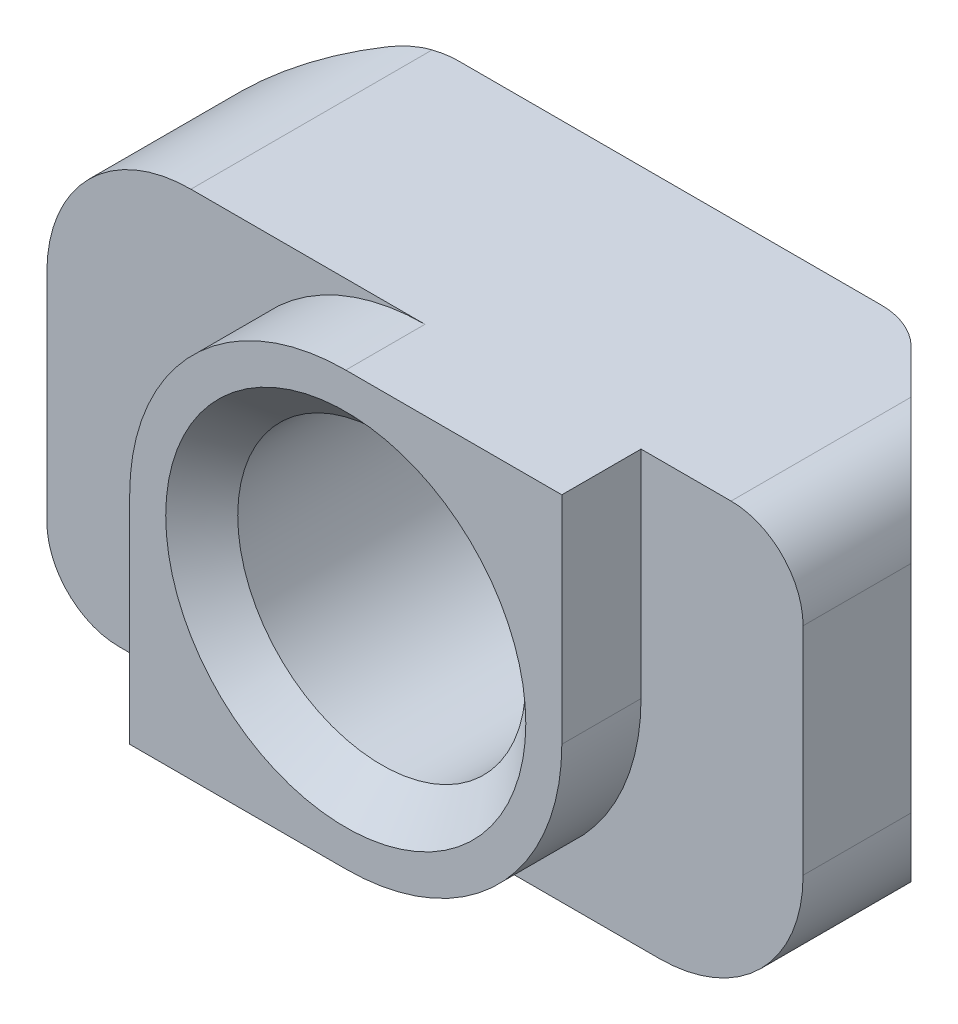
ISO-10303-21;
HEADER;
FILE_DESCRIPTION(('STEP AP214'),'2;1');
FILE_NAME('part.step','',(''),(''),'','','');
FILE_SCHEMA(('AUTOMOTIVE_DESIGN { 1 0 10303 214 1 1 1 1 }'));
ENDSEC;
DATA;
#1=APPLICATION_CONTEXT('core data for automotive mechanical design processes');
#2=APPLICATION_PROTOCOL_DEFINITION('international standard','automotive_design',2000,#1);
#3=PRODUCT_CONTEXT('',#1,'mechanical');
#4=PRODUCT('Part','Part','',(#3));
#5=PRODUCT_RELATED_PRODUCT_CATEGORY('part','',(#4));
#6=PRODUCT_DEFINITION_FORMATION('','',#4);
#7=PRODUCT_DEFINITION_CONTEXT('part definition',#1,'design');
#8=PRODUCT_DEFINITION('design','',#6,#7);
#9=PRODUCT_DEFINITION_SHAPE('','',#8);
#10=(LENGTH_UNIT() NAMED_UNIT(*) SI_UNIT(.MILLI.,.METRE.));
#11=(NAMED_UNIT(*) PLANE_ANGLE_UNIT() SI_UNIT($,.RADIAN.));
#12=(NAMED_UNIT(*) SI_UNIT($,.STERADIAN.) SOLID_ANGLE_UNIT());
#13=UNCERTAINTY_MEASURE_WITH_UNIT(LENGTH_MEASURE(1.E-05),#10,'distance_accuracy_value','');
#14=(GEOMETRIC_REPRESENTATION_CONTEXT(3) GLOBAL_UNCERTAINTY_ASSIGNED_CONTEXT((#13)) GLOBAL_UNIT_ASSIGNED_CONTEXT((#10,
#11,#12)) REPRESENTATION_CONTEXT('',''));
#15=CARTESIAN_POINT('',(0.,0.,0.));
#16=DIRECTION('',(0.,0.,1.));
#17=DIRECTION('',(1.,0.,0.));
#18=AXIS2_PLACEMENT_3D('',#15,#16,#17);
#19=CARTESIAN_POINT('',(-5.24999999992069,3.,4.5));
#20=DIRECTION('',(-1.,0.,0.));
#21=DIRECTION('',(0.,0.,1.));
#22=AXIS2_PLACEMENT_3D('',#19,#20,#21);
#23=PLANE('',#22);
#24=DIRECTION('',(0.,1.,0.));
#25=VECTOR('',#24,1.);
#26=CARTESIAN_POINT('',(-5.24999999992069,3.,1.9));
#27=LINE('',#26,#25);
#28=CARTESIAN_POINT('',(-5.24999999992069,-2.,1.9));
#29=VERTEX_POINT('',#28);
#30=CARTESIAN_POINT('',(-5.24999999992069,1.,1.9));
#31=VERTEX_POINT('',#30);
#32=EDGE_CURVE('E190',#29,#31,#27,.T.);
#33=ORIENTED_EDGE('',*,*,#32,.F.);
#34=DIRECTION('',(0.,0.,1.));
#35=VECTOR('',#34,1.);
#36=CARTESIAN_POINT('',(-5.24999999992069,-2.,4.5));
#37=LINE('',#36,#35);
#38=CARTESIAN_POINT('',(-5.24999999992069,-2.,3.4));
#39=VERTEX_POINT('',#38);
#40=EDGE_CURVE('E158',#29,#39,#37,.T.);
#41=ORIENTED_EDGE('',*,*,#40,.T.);
#42=DIRECTION('',(0.,1.,0.));
#43=VECTOR('',#42,1.);
#44=CARTESIAN_POINT('',(-5.24999999992069,-3.,3.4));
#45=LINE('',#44,#43);
#46=CARTESIAN_POINT('',(-5.24999999992069,1.,3.4));
#47=VERTEX_POINT('',#46);
#48=EDGE_CURVE('E462',#39,#47,#45,.T.);
#49=ORIENTED_EDGE('',*,*,#48,.T.);
#50=DIRECTION('',(0.,0.,-1.));
#51=VECTOR('',#50,1.);
#52=CARTESIAN_POINT('',(-5.24999999992069,1.,4.5));
#53=LINE('',#52,#51);
#54=EDGE_CURVE('E172',#31,#47,#53,.F.);
#55=ORIENTED_EDGE('',*,*,#54,.F.);
#56=EDGE_LOOP('',(#33,#41,#49,#55));
#57=FACE_BOUND('',#56,.T.);
#58=ADVANCED_FACE('F20',(#57),#23,.T.);
#59=CARTESIAN_POINT('',(0.,0.,0.));
#60=DIRECTION('',(0.,0.,-1.));
#61=DIRECTION('',(-1.,0.,0.));
#62=AXIS2_PLACEMENT_3D('',#59,#60,#61);
#63=CYLINDRICAL_SURFACE('',#62,2.);
#64=CARTESIAN_POINT('',(0.,0.,4.00000000007594));
#65=DIRECTION('',(0.,0.,1.));
#66=DIRECTION('',(1.,0.,0.));
#67=AXIS2_PLACEMENT_3D('',#64,#65,#66);
#68=CIRCLE('',#67,2.00000000000955);
#69=CARTESIAN_POINT('',(2.00000000000955,0.,4.00000000007594));
#70=VERTEX_POINT('',#69);
#71=EDGE_CURVE('E176',#70,#70,#68,.T.);
#72=ORIENTED_EDGE('',*,*,#71,.T.);
#73=EDGE_LOOP('',(#72));
#74=FACE_BOUND('',#73,.T.);
#75=CARTESIAN_POINT('',(0.,0.,0.50000000004502));
#76=DIRECTION('',(0.,0.,-1.));
#77=DIRECTION('',(-1.,0.,0.));
#78=AXIS2_PLACEMENT_3D('',#75,#76,#77);
#79=CIRCLE('',#78,1.99999999995271);
#80=CARTESIAN_POINT('',(-1.99999999995271,0.,0.50000000004502));
#81=VERTEX_POINT('',#80);
#82=EDGE_CURVE('E291',#81,#81,#79,.T.);
#83=ORIENTED_EDGE('',*,*,#82,.T.);
#84=EDGE_LOOP('',(#83));
#85=FACE_BOUND('',#84,.T.);
#86=ADVANCED_FACE('F301',(#74,#85),#63,.F.);
#87=CARTESIAN_POINT('',(4.25000000007932,2.,1.9));
#88=DIRECTION('',(0.,0.,1.));
#89=DIRECTION('',(1.,0.,0.));
#90=AXIS2_PLACEMENT_3D('',#87,#88,#89);
#91=CYLINDRICAL_SURFACE('',#90,1.);
#92=CARTESIAN_POINT('',(4.25000000007932,2.,3.4));
#93=DIRECTION('',(0.,0.,1.));
#94=DIRECTION('',(1.,0.,0.));
#95=AXIS2_PLACEMENT_3D('',#92,#93,#94);
#96=CIRCLE('',#95,1.);
#97=CARTESIAN_POINT('',(4.25000000007932,3.,3.4));
#98=VERTEX_POINT('',#97);
#99=CARTESIAN_POINT('',(5.25000000007931,2.,3.4));
#100=VERTEX_POINT('',#99);
#101=EDGE_CURVE('E23',#98,#100,#96,.F.);
#102=ORIENTED_EDGE('',*,*,#101,.T.);
#103=DIRECTION('',(0.,0.,1.));
#104=VECTOR('',#103,1.);
#105=CARTESIAN_POINT('',(5.25000000007932,2.,1.9));
#106=LINE('',#105,#104);
#107=CARTESIAN_POINT('',(5.25000000007932,2.,1.9));
#108=VERTEX_POINT('',#107);
#109=EDGE_CURVE('E157',#100,#108,#106,.F.);
#110=ORIENTED_EDGE('',*,*,#109,.T.);
#111=CARTESIAN_POINT('',(4.25000000007932,2.,0.899999999999999));
#112=DIRECTION('',(0.707106781186548,0.,-0.707106781186547));
#113=DIRECTION('',(0.707106781186547,0.,0.707106781186548));
#114=AXIS2_PLACEMENT_3D('',#111,#112,#113);
#115=ELLIPSE('',#114,1.4142135623731,1.);
#116=CARTESIAN_POINT('',(4.25000000007932,3.,0.899999999999999));
#117=VERTEX_POINT('',#116);
#118=EDGE_CURVE('E161',#117,#108,#115,.T.);
#119=ORIENTED_EDGE('',*,*,#118,.F.);
#120=DIRECTION('',(0.,0.,1.));
#121=VECTOR('',#120,1.);
#122=CARTESIAN_POINT('',(4.25000000007932,3.,0.));
#123=LINE('',#122,#121);
#124=EDGE_CURVE('E137',#98,#117,#123,.F.);
#125=ORIENTED_EDGE('',*,*,#124,.F.);
#126=EDGE_LOOP('',(#102,#110,#119,#125));
#127=FACE_BOUND('',#126,.T.);
#128=ADVANCED_FACE('F159',(#127),#91,.T.);
#129=CARTESIAN_POINT('',(-3.24999999992069,1.,4.5));
#130=DIRECTION('',(0.,0.,-1.));
#131=DIRECTION('',(-1.,0.,0.));
#132=AXIS2_PLACEMENT_3D('',#129,#130,#131);
#133=CYLINDRICAL_SURFACE('',#132,2.);
#134=CARTESIAN_POINT('',(-3.24999999992069,1.,-0.100000000000001));
#135=DIRECTION('',(-0.707106781186547,0.,-0.707106781186548));
#136=DIRECTION('',(0.707106781186548,0.,-0.707106781186547));
#137=AXIS2_PLACEMENT_3D('',#134,#135,#136);
#138=ELLIPSE('',#137,2.82842712474619,2.);
#139=CARTESIAN_POINT('',(-3.64289321873414,2.96102904583548,0.292893218813451));
#140=VERTEX_POINT('',#139);
#141=EDGE_CURVE('E195',#31,#140,#138,.T.);
#142=ORIENTED_EDGE('',*,*,#141,.F.);
#143=ORIENTED_EDGE('',*,*,#54,.T.);
#144=CARTESIAN_POINT('',(-3.24999999992069,1.,3.4));
#145=DIRECTION('',(0.,0.,-1.));
#146=DIRECTION('',(-1.,0.,0.));
#147=AXIS2_PLACEMENT_3D('',#144,#145,#146);
#148=CIRCLE('',#147,2.);
#149=CARTESIAN_POINT('',(-3.24999999992069,3.,3.4));
#150=VERTEX_POINT('',#149);
#151=EDGE_CURVE('E351',#47,#150,#148,.T.);
#152=ORIENTED_EDGE('',*,*,#151,.T.);
#153=DIRECTION('',(0.,0.,1.));
#154=VECTOR('',#153,1.);
#155=CARTESIAN_POINT('',(-3.24999999992069,3.,0.));
#156=LINE('',#155,#154);
#157=CARTESIAN_POINT('',(-3.24999999992069,3.,0.050647674874702));
#158=VERTEX_POINT('',#157);
#159=EDGE_CURVE('E440',#158,#150,#156,.T.);
#160=ORIENTED_EDGE('',*,*,#159,.F.);
#161=CARTESIAN_POINT('',(-3.64289321873414,2.96102904583548,0.292893218813452));
#162=CARTESIAN_POINT('',(-3.62373129166763,2.96486739205561,0.273734909462323));
#163=CARTESIAN_POINT('',(-3.6037909688252,2.96857044721912,0.255350210998022));
#164=CARTESIAN_POINT('',(-3.56242404292472,2.97555905905267,0.220214896195654));
#165=CARTESIAN_POINT('',(-3.54099627584073,2.97884428291578,0.203465584896518));
#166=CARTESIAN_POINT('',(-3.47558885689957,2.98771418498483,0.15652935665072));
#167=CARTESIAN_POINT('',(-3.42964961075721,2.9924911126814,0.128820433784843));
#168=CARTESIAN_POINT('',(-3.36060069256883,2.99705306951209,0.0944087799793435));
#169=CARTESIAN_POINT('',(-3.33905599602591,2.99813621412752,0.0846121725838686));
#170=CARTESIAN_POINT('',(-3.29510653803597,2.99961320906011,0.0664808433173908));
#171=CARTESIAN_POINT('',(-3.27269571659946,3.00000067051874,0.0581602973729092));
#172=CARTESIAN_POINT('',(-3.24999999992069,3.,0.050647674874702));
#173=B_SPLINE_CURVE_WITH_KNOTS('',3,(#161,#162,#163,#164,#165,#166,#167,#168,#169,#170,#171,
#172),.UNSPECIFIED.,.F.,.F.,(4,2,2,2,2,4),(0.,0.0820458942762544,0.164156735051673,
0.324838577424529,0.395859666914342,0.467529711199153),.UNSPECIFIED.);
#174=EDGE_CURVE('E282',#140,#158,#173,.T.);
#175=ORIENTED_EDGE('',*,*,#174,.F.);
#176=EDGE_LOOP('',(#142,#143,#152,#160,#175));
#177=FACE_BOUND('',#176,.T.);
#178=ADVANCED_FACE('F293',(#177),#133,.T.);
#179=CARTESIAN_POINT('',(-3.,-3.,3.4));
#180=DIRECTION('',(0.,0.,-1.));
#181=DIRECTION('',(-1.,0.,0.));
#182=AXIS2_PLACEMENT_3D('',#179,#180,#181);
#183=PLANE('',#182);
#184=ORIENTED_EDGE('',*,*,#151,.F.);
#185=ORIENTED_EDGE('',*,*,#48,.F.);
#186=CARTESIAN_POINT('',(-4.24999999992069,-2.,3.4));
#187=DIRECTION('',(0.,0.,1.));
#188=DIRECTION('',(1.,0.,0.));
#189=AXIS2_PLACEMENT_3D('',#186,#187,#188);
#190=CIRCLE('',#189,1.);
#191=CARTESIAN_POINT('',(-4.24999999992069,-3.,3.4));
#192=VERTEX_POINT('',#191);
#193=EDGE_CURVE('E467',#192,#39,#190,.F.);
#194=ORIENTED_EDGE('',*,*,#193,.F.);
#195=DIRECTION('',(-1.,0.,0.));
#196=VECTOR('',#195,1.);
#197=CARTESIAN_POINT('',(-3.,-3.,3.4));
#198=LINE('',#197,#196);
#199=CARTESIAN_POINT('',(-3.,-3.,3.4));
#200=VERTEX_POINT('',#199);
#201=EDGE_CURVE('E455',#200,#192,#198,.T.);
#202=ORIENTED_EDGE('',*,*,#201,.F.);
#203=DIRECTION('',(0.,1.,0.));
#204=VECTOR('',#203,1.);
#205=CARTESIAN_POINT('',(-3.,-3.,3.4));
#206=LINE('',#205,#204);
#207=CARTESIAN_POINT('',(-3.,0.,3.4));
#208=VERTEX_POINT('',#207);
#209=EDGE_CURVE('E428',#200,#208,#206,.T.);
#210=ORIENTED_EDGE('',*,*,#209,.T.);
#211=CARTESIAN_POINT('',(0.,0.,3.4));
#212=DIRECTION('',(0.,0.,1.));
#213=DIRECTION('',(1.,0.,0.));
#214=AXIS2_PLACEMENT_3D('',#211,#212,#213);
#215=CIRCLE('',#214,3.);
#216=CARTESIAN_POINT('',(0.,3.,3.4));
#217=VERTEX_POINT('',#216);
#218=EDGE_CURVE('E433',#217,#208,#215,.T.);
#219=ORIENTED_EDGE('',*,*,#218,.F.);
#220=DIRECTION('',(1.,0.,0.));
#221=VECTOR('',#220,1.);
#222=CARTESIAN_POINT('',(0.,3.,3.4));
#223=LINE('',#222,#221);
#224=EDGE_CURVE('E146',#150,#217,#223,.T.);
#225=ORIENTED_EDGE('',*,*,#224,.F.);
#226=EDGE_LOOP('',(#184,#185,#194,#202,#210,#219,#225));
#227=FACE_BOUND('',#226,.T.);
#228=ADVANCED_FACE('F298',(#227),#183,.F.);
#229=CARTESIAN_POINT('',(3.35000000007932,3.,0.));
#230=DIRECTION('',(0.707106781186548,0.,-0.707106781186547));
#231=DIRECTION('',(-0.707106781186547,0.,-0.707106781186548));
#232=AXIS2_PLACEMENT_3D('',#229,#230,#231);
#233=PLANE('',#232);
#234=DIRECTION('',(-0.707106781186547,0.,-0.707106781186547));
#235=VECTOR('',#234,1.);
#236=CARTESIAN_POINT('',(4.25000000007932,3.,0.899999999999999));
#237=LINE('',#236,#235);
#238=CARTESIAN_POINT('',(3.64289321889277,3.,0.292893218813452));
#239=VERTEX_POINT('',#238);
#240=EDGE_CURVE('E164',#117,#239,#237,.T.);
#241=ORIENTED_EDGE('',*,*,#240,.F.);
#242=ORIENTED_EDGE('',*,*,#118,.T.);
#243=DIRECTION('',(0.,1.,0.));
#244=VECTOR('',#243,1.);
#245=CARTESIAN_POINT('',(5.25000000007932,3.,1.9));
#246=LINE('',#245,#244);
#247=CARTESIAN_POINT('',(5.25000000007932,-1.,1.9));
#248=VERTEX_POINT('',#247);
#249=EDGE_CURVE('E209',#248,#108,#246,.T.);
#250=ORIENTED_EDGE('',*,*,#249,.F.);
#251=CARTESIAN_POINT('',(3.25000000007932,-1.,-0.100000000000002));
#252=DIRECTION('',(0.707106781186548,0.,-0.707106781186547));
#253=DIRECTION('',(-0.707106781186547,0.,-0.707106781186548));
#254=AXIS2_PLACEMENT_3D('',#251,#252,#253);
#255=ELLIPSE('',#254,2.82842712474619,2.);
#256=CARTESIAN_POINT('',(3.64289321889277,-2.96102904583548,0.292893218813452));
#257=VERTEX_POINT('',#256);
#258=EDGE_CURVE('E213',#257,#248,#255,.F.);
#259=ORIENTED_EDGE('',*,*,#258,.F.);
#260=DIRECTION('',(0.,-1.,0.));
#261=VECTOR('',#260,1.);
#262=CARTESIAN_POINT('',(3.64289321889277,3.,0.292893218813452));
#263=LINE('',#262,#261);
#264=EDGE_CURVE('E199',#239,#257,#263,.T.);
#265=ORIENTED_EDGE('',*,*,#264,.F.);
#266=EDGE_LOOP('',(#241,#242,#250,#259,#265));
#267=FACE_BOUND('',#266,.T.);
#268=ADVANCED_FACE('F341',(#267),#233,.T.);
#269=CARTESIAN_POINT('',(0.,0.,0.));
#270=DIRECTION('',(0.,0.,-1.));
#271=DIRECTION('',(-1.,0.,0.));
#272=AXIS2_PLACEMENT_3D('',#269,#270,#271);
#273=CONICAL_SURFACE('',#272,2.49999999999773,0.785398163397448);
#274=ORIENTED_EDGE('',*,*,#82,.F.);
#275=EDGE_LOOP('',(#274));
#276=FACE_BOUND('',#275,.T.);
#277=CARTESIAN_POINT('',(0.,0.,0.));
#278=DIRECTION('',(0.,0.,-1.));
#279=DIRECTION('',(-1.,0.,0.));
#280=AXIS2_PLACEMENT_3D('',#277,#278,#279);
#281=CIRCLE('',#280,2.49999999999773);
#282=CARTESIAN_POINT('',(-2.49999999999773,0.,0.));
#283=VERTEX_POINT('',#282);
#284=EDGE_CURVE('E246',#283,#283,#281,.F.);
#285=ORIENTED_EDGE('',*,*,#284,.F.);
#286=EDGE_LOOP('',(#285));
#287=FACE_BOUND('',#286,.T.);
#288=ADVANCED_FACE('F278',(#276,#287),#273,.F.);
#289=CARTESIAN_POINT('',(-2.93578643754759,3.,1.));
#290=DIRECTION('',(0.,-1.,0.));
#291=DIRECTION('',(0.,0.,-1.));
#292=AXIS2_PLACEMENT_3D('',#289,#290,#291);
#293=CYLINDRICAL_SURFACE('',#292,1.);
#294=DIRECTION('',(0.,1.,0.));
#295=VECTOR('',#294,1.);
#296=CARTESIAN_POINT('',(-2.93578643754759,3.,0.));
#297=LINE('',#296,#295);
#298=CARTESIAN_POINT('',(-2.93578643754759,-3.,0.));
#299=VERTEX_POINT('',#298);
#300=CARTESIAN_POINT('',(-2.93578643754759,3.,0.));
#301=VERTEX_POINT('',#300);
#302=EDGE_CURVE('E208',#299,#301,#297,.T.);
#303=ORIENTED_EDGE('',*,*,#302,.F.);
#304=CARTESIAN_POINT('',(-2.93578643754759,-3.,1.));
#305=DIRECTION('',(0.,-1.,0.));
#306=DIRECTION('',(0.,0.,-1.));
#307=AXIS2_PLACEMENT_3D('',#304,#305,#306);
#308=CIRCLE('',#307,1.);
#309=CARTESIAN_POINT('',(-3.64289321873414,-3.,0.292893218813451));
#310=VERTEX_POINT('',#309);
#311=EDGE_CURVE('E202',#299,#310,#308,.F.);
#312=ORIENTED_EDGE('',*,*,#311,.T.);
#313=DIRECTION('',(0.,1.,0.));
#314=VECTOR('',#313,1.);
#315=CARTESIAN_POINT('',(-3.64289321873414,3.,0.292893218813451));
#316=LINE('',#315,#314);
#317=EDGE_CURVE('E197',#140,#310,#316,.F.);
#318=ORIENTED_EDGE('',*,*,#317,.F.);
#319=ORIENTED_EDGE('',*,*,#174,.T.);
#320=CARTESIAN_POINT('',(-2.93578643754759,3.,1.));
#321=DIRECTION('',(0.,-1.,0.));
#322=DIRECTION('',(0.,0.,-1.));
#323=AXIS2_PLACEMENT_3D('',#320,#321,#322);
#324=CIRCLE('',#323,1.);
#325=EDGE_CURVE('E443',#301,#158,#324,.F.);
#326=ORIENTED_EDGE('',*,*,#325,.F.);
#327=EDGE_LOOP('',(#303,#312,#318,#319,#326));
#328=FACE_BOUND('',#327,.T.);
#329=ADVANCED_FACE('F272',(#328),#293,.T.);
#330=CARTESIAN_POINT('',(2.93578643770622,3.,1.));
#331=DIRECTION('',(0.,-1.,0.));
#332=DIRECTION('',(0.,0.,-1.));
#333=AXIS2_PLACEMENT_3D('',#330,#331,#332);
#334=CYLINDRICAL_SURFACE('',#333,1.);
#335=DIRECTION('',(0.,1.,0.));
#336=VECTOR('',#335,1.);
#337=CARTESIAN_POINT('',(2.93578643770622,3.,0.));
#338=LINE('',#337,#336);
#339=CARTESIAN_POINT('',(2.93578643770622,3.,0.));
#340=VERTEX_POINT('',#339);
#341=CARTESIAN_POINT('',(2.93578643770622,-3.,0.));
#342=VERTEX_POINT('',#341);
#343=EDGE_CURVE('E207',#340,#342,#338,.F.);
#344=ORIENTED_EDGE('',*,*,#343,.F.);
#345=CARTESIAN_POINT('',(2.93578643770622,3.,1.));
#346=DIRECTION('',(0.,-1.,0.));
#347=DIRECTION('',(0.,0.,-1.));
#348=AXIS2_PLACEMENT_3D('',#345,#346,#347);
#349=CIRCLE('',#348,1.);
#350=EDGE_CURVE('E168',#239,#340,#349,.F.);
#351=ORIENTED_EDGE('',*,*,#350,.F.);
#352=ORIENTED_EDGE('',*,*,#264,.T.);
#353=CARTESIAN_POINT('',(3.25000000007932,-3.,0.050647674874702));
#354=CARTESIAN_POINT('',(3.27598457197076,-3.00000195656554,0.0592478826740969));
#355=CARTESIAN_POINT('',(3.30159545968404,-2.99949314886404,0.0689092401342109));
#356=CARTESIAN_POINT('',(3.35191005518063,-2.99756027304049,0.0902807894398044));
#357=CARTESIAN_POINT('',(3.37661383732269,-2.99613628011737,0.101990812892967));
#358=CARTESIAN_POINT('',(3.44813251419916,-2.99072630423622,0.139561468018129));
#359=CARTESIAN_POINT('',(3.49344030364462,-2.98559293904475,0.168225656219934));
#360=CARTESIAN_POINT('',(3.55486223762956,-2.97672080723523,0.214313452193862));
#361=CARTESIAN_POINT('',(3.57316483598175,-2.97380106071673,0.229089759911021));
#362=CARTESIAN_POINT('',(3.60881346490518,-2.96763339785437,0.260004011894241));
#363=CARTESIAN_POINT('',(3.6261495688144,-2.96438279994789,0.276152872964915));
#364=CARTESIAN_POINT('',(3.64289321889277,-2.96102904583548,0.292893218813453));
#365=B_SPLINE_CURVE_WITH_KNOTS('',3,(#353,#354,#355,#356,#357,#358,#359,#360,#361,#362,#363,
#364),.UNSPECIFIED.,.F.,.F.,(4,2,2,2,2,4),(0.,0.0820444331220174,0.164082125678799,
0.324768191847388,0.395833673745903,0.467529612632991),.UNSPECIFIED.);
#366=CARTESIAN_POINT('',(3.25000000007932,-3.,0.050647674874702));
#367=VERTEX_POINT('',#366);
#368=EDGE_CURVE('E250',#367,#257,#365,.T.);
#369=ORIENTED_EDGE('',*,*,#368,.F.);
#370=CARTESIAN_POINT('',(2.93578643770622,-3.,1.));
#371=DIRECTION('',(0.,-1.,0.));
#372=DIRECTION('',(0.,0.,-1.));
#373=AXIS2_PLACEMENT_3D('',#370,#371,#372);
#374=CIRCLE('',#373,1.);
#375=EDGE_CURVE('E196',#367,#342,#374,.F.);
#376=ORIENTED_EDGE('',*,*,#375,.T.);
#377=EDGE_LOOP('',(#344,#351,#352,#369,#376));
#378=FACE_BOUND('',#377,.T.);
#379=ADVANCED_FACE('F266',(#378),#334,.T.);
#380=CARTESIAN_POINT('',(-5.24999999992069,3.,1.9));
#381=DIRECTION('',(-0.707106781186547,0.,-0.707106781186548));
#382=DIRECTION('',(-0.707106781186548,0.,0.707106781186547));
#383=AXIS2_PLACEMENT_3D('',#380,#381,#382);
#384=PLANE('',#383);
#385=DIRECTION('',(-0.707106781186548,0.,0.707106781186547));
#386=VECTOR('',#385,1.);
#387=CARTESIAN_POINT('',(-5.24999999992069,-3.,1.9));
#388=LINE('',#387,#386);
#389=CARTESIAN_POINT('',(-4.24999999992069,-3.,0.899999999999999));
#390=VERTEX_POINT('',#389);
#391=EDGE_CURVE('E181',#310,#390,#388,.T.);
#392=ORIENTED_EDGE('',*,*,#391,.T.);
#393=CARTESIAN_POINT('',(-4.24999999992069,-2.,0.899999999999999));
#394=DIRECTION('',(-0.707106781186547,0.,-0.707106781186548));
#395=DIRECTION('',(-0.707106781186548,0.,0.707106781186547));
#396=AXIS2_PLACEMENT_3D('',#393,#394,#395);
#397=ELLIPSE('',#396,1.41421356237309,1.);
#398=EDGE_CURVE('E242',#29,#390,#397,.F.);
#399=ORIENTED_EDGE('',*,*,#398,.F.);
#400=ORIENTED_EDGE('',*,*,#32,.T.);
#401=ORIENTED_EDGE('',*,*,#141,.T.);
#402=ORIENTED_EDGE('',*,*,#317,.T.);
#403=EDGE_LOOP('',(#392,#399,#400,#401,#402));
#404=FACE_BOUND('',#403,.T.);
#405=ADVANCED_FACE('F271',(#404),#384,.T.);
#406=CARTESIAN_POINT('',(0.,0.,4.50000000000728));
#407=DIRECTION('',(0.,0.,1.));
#408=DIRECTION('',(1.,0.,0.));
#409=AXIS2_PLACEMENT_3D('',#406,#407,#408);
#410=CONICAL_SURFACE('',#409,2.49999999994088,0.785398163340605);
#411=ORIENTED_EDGE('',*,*,#71,.F.);
#412=EDGE_LOOP('',(#411));
#413=FACE_BOUND('',#412,.T.);
#414=CARTESIAN_POINT('',(0.,0.,4.50000000000728));
#415=DIRECTION('',(0.,0.,1.));
#416=DIRECTION('',(1.,0.,0.));
#417=AXIS2_PLACEMENT_3D('',#414,#415,#416);
#418=CIRCLE('',#417,2.49999999994088);
#419=CARTESIAN_POINT('',(2.49999999994088,0.,4.50000000000728));
#420=VERTEX_POINT('',#419);
#421=EDGE_CURVE('E238',#420,#420,#418,.F.);
#422=ORIENTED_EDGE('',*,*,#421,.F.);
#423=EDGE_LOOP('',(#422));
#424=FACE_BOUND('',#423,.T.);
#425=ADVANCED_FACE('F542',(#413,#424),#410,.F.);
#426=CARTESIAN_POINT('',(0.,3.,0.));
#427=DIRECTION('',(0.,1.,0.));
#428=DIRECTION('',(0.,0.,1.));
#429=AXIS2_PLACEMENT_3D('',#426,#427,#428);
#430=PLANE('',#429);
#431=ORIENTED_EDGE('',*,*,#325,.T.);
#432=ORIENTED_EDGE('',*,*,#159,.T.);
#433=ORIENTED_EDGE('',*,*,#224,.T.);
#434=DIRECTION('',(0.,0.,1.));
#435=VECTOR('',#434,1.);
#436=CARTESIAN_POINT('',(0.,3.,4.5));
#437=LINE('',#436,#435);
#438=CARTESIAN_POINT('',(0.,3.,4.5));
#439=VERTEX_POINT('',#438);
#440=EDGE_CURVE('E436',#439,#217,#437,.F.);
#441=ORIENTED_EDGE('',*,*,#440,.F.);
#442=DIRECTION('',(1.,0.,0.));
#443=VECTOR('',#442,1.);
#444=CARTESIAN_POINT('',(5.25000000007932,3.,4.5));
#445=LINE('',#444,#443);
#446=CARTESIAN_POINT('',(3.00000000007932,3.,4.5));
#447=VERTEX_POINT('',#446);
#448=EDGE_CURVE('E230',#447,#439,#445,.F.);
#449=ORIENTED_EDGE('',*,*,#448,.F.);
#450=DIRECTION('',(0.,0.,1.));
#451=VECTOR('',#450,1.);
#452=CARTESIAN_POINT('',(3.00000000007932,3.,3.4));
#453=LINE('',#452,#451);
#454=CARTESIAN_POINT('',(3.00000000007932,3.,3.4));
#455=VERTEX_POINT('',#454);
#456=EDGE_CURVE('E141',#447,#455,#453,.F.);
#457=ORIENTED_EDGE('',*,*,#456,.T.);
#458=DIRECTION('',(1.,0.,0.));
#459=VECTOR('',#458,1.);
#460=CARTESIAN_POINT('',(0.,3.,3.4));
#461=LINE('',#460,#459);
#462=EDGE_CURVE('E132',#455,#98,#461,.T.);
#463=ORIENTED_EDGE('',*,*,#462,.T.);
#464=ORIENTED_EDGE('',*,*,#124,.T.);
#465=ORIENTED_EDGE('',*,*,#240,.T.);
#466=ORIENTED_EDGE('',*,*,#350,.T.);
#467=DIRECTION('',(-1.,0.,0.));
#468=VECTOR('',#467,1.);
#469=CARTESIAN_POINT('',(-3.34999999992069,3.,0.));
#470=LINE('',#469,#468);
#471=EDGE_CURVE('E203',#301,#340,#470,.F.);
#472=ORIENTED_EDGE('',*,*,#471,.F.);
#473=EDGE_LOOP('',(#431,#432,#433,#441,#449,#457,#463,#464,#465,#466,#472));
#474=FACE_BOUND('',#473,.T.);
#475=ADVANCED_FACE('F135',(#474),#430,.T.);
#476=CARTESIAN_POINT('',(0.,0.,4.5));
#477=DIRECTION('',(0.,0.,1.));
#478=DIRECTION('',(1.,0.,0.));
#479=AXIS2_PLACEMENT_3D('',#476,#477,#478);
#480=CYLINDRICAL_SURFACE('',#479,3.);
#481=ORIENTED_EDGE('',*,*,#218,.T.);
#482=DIRECTION('',(0.,0.,-1.));
#483=VECTOR('',#482,1.);
#484=CARTESIAN_POINT('',(-3.,0.,4.5));
#485=LINE('',#484,#483);
#486=CARTESIAN_POINT('',(-3.,0.,4.5));
#487=VERTEX_POINT('',#486);
#488=EDGE_CURVE('E424',#208,#487,#485,.F.);
#489=ORIENTED_EDGE('',*,*,#488,.T.);
#490=CARTESIAN_POINT('',(0.,0.,4.5));
#491=DIRECTION('',(0.,0.,1.));
#492=DIRECTION('',(1.,0.,0.));
#493=AXIS2_PLACEMENT_3D('',#490,#491,#492);
#494=CIRCLE('',#493,3.);
#495=EDGE_CURVE('E225',#439,#487,#494,.T.);
#496=ORIENTED_EDGE('',*,*,#495,.F.);
#497=ORIENTED_EDGE('',*,*,#440,.T.);
#498=EDGE_LOOP('',(#481,#489,#496,#497));
#499=FACE_BOUND('',#498,.T.);
#500=ADVANCED_FACE('F488',(#499),#480,.T.);
#501=CARTESIAN_POINT('',(-3.,-3.,4.5));
#502=DIRECTION('',(1.,0.,0.));
#503=DIRECTION('',(0.,0.,-1.));
#504=AXIS2_PLACEMENT_3D('',#501,#502,#503);
#505=PLANE('',#504);
#506=ORIENTED_EDGE('',*,*,#488,.F.);
#507=ORIENTED_EDGE('',*,*,#209,.F.);
#508=DIRECTION('',(0.,0.,-1.));
#509=VECTOR('',#508,1.);
#510=CARTESIAN_POINT('',(-3.,-3.,4.5));
#511=LINE('',#510,#509);
#512=CARTESIAN_POINT('',(-3.,-3.,4.5));
#513=VERTEX_POINT('',#512);
#514=EDGE_CURVE('E429',#513,#200,#511,.T.);
#515=ORIENTED_EDGE('',*,*,#514,.F.);
#516=DIRECTION('',(0.,1.,0.));
#517=VECTOR('',#516,1.);
#518=CARTESIAN_POINT('',(-3.,3.,4.5));
#519=LINE('',#518,#517);
#520=EDGE_CURVE('E229',#487,#513,#519,.F.);
#521=ORIENTED_EDGE('',*,*,#520,.F.);
#522=EDGE_LOOP('',(#506,#507,#515,#521));
#523=FACE_BOUND('',#522,.T.);
#524=ADVANCED_FACE('F533',(#523),#505,.F.);
#525=CARTESIAN_POINT('',(7.93163278112186E-11,0.,0.));
#526=DIRECTION('',(0.,0.,1.));
#527=DIRECTION('',(1.,0.,0.));
#528=AXIS2_PLACEMENT_3D('',#525,#526,#527);
#529=CYLINDRICAL_SURFACE('',#528,3.);
#530=CARTESIAN_POINT('',(7.93163278112186E-11,0.,4.5));
#531=DIRECTION('',(0.,0.,1.));
#532=DIRECTION('',(1.,0.,0.));
#533=AXIS2_PLACEMENT_3D('',#530,#531,#532);
#534=CIRCLE('',#533,3.);
#535=CARTESIAN_POINT('',(7.93160522656887E-11,-3.,4.5));
#536=VERTEX_POINT('',#535);
#537=CARTESIAN_POINT('',(3.00000000007932,0.,4.5));
#538=VERTEX_POINT('',#537);
#539=EDGE_CURVE('E233',#536,#538,#534,.T.);
#540=ORIENTED_EDGE('',*,*,#539,.F.);
#541=DIRECTION('',(0.,0.,1.));
#542=VECTOR('',#541,1.);
#543=CARTESIAN_POINT('',(7.93157767201589E-11,-3.,0.));
#544=LINE('',#543,#542);
#545=CARTESIAN_POINT('',(7.93160522656887E-11,-3.,3.4));
#546=VERTEX_POINT('',#545);
#547=EDGE_CURVE('E39',#536,#546,#544,.F.);
#548=ORIENTED_EDGE('',*,*,#547,.T.);
#549=CARTESIAN_POINT('',(7.93163278112186E-11,0.,3.4));
#550=DIRECTION('',(0.,0.,1.));
#551=DIRECTION('',(1.,0.,0.));
#552=AXIS2_PLACEMENT_3D('',#549,#550,#551);
#553=CIRCLE('',#552,3.);
#554=CARTESIAN_POINT('',(3.00000000007932,0.,3.4));
#555=VERTEX_POINT('',#554);
#556=EDGE_CURVE('E231',#546,#555,#553,.T.);
#557=ORIENTED_EDGE('',*,*,#556,.T.);
#558=DIRECTION('',(0.,0.,1.));
#559=VECTOR('',#558,1.);
#560=CARTESIAN_POINT('',(3.00000000007932,0.,3.4));
#561=LINE('',#560,#559);
#562=EDGE_CURVE('E214',#555,#538,#561,.T.);
#563=ORIENTED_EDGE('',*,*,#562,.T.);
#564=EDGE_LOOP('',(#540,#548,#557,#563));
#565=FACE_BOUND('',#564,.T.);
#566=ADVANCED_FACE('F508',(#565),#529,.T.);
#567=CARTESIAN_POINT('',(3.00000000007932,-3.,3.4));
#568=DIRECTION('',(-1.,0.,0.));
#569=DIRECTION('',(0.,0.,1.));
#570=AXIS2_PLACEMENT_3D('',#567,#568,#569);
#571=PLANE('',#570);
#572=ORIENTED_EDGE('',*,*,#562,.F.);
#573=DIRECTION('',(0.,1.,0.));
#574=VECTOR('',#573,1.);
#575=CARTESIAN_POINT('',(3.00000000007932,-3.,3.4));
#576=LINE('',#575,#574);
#577=EDGE_CURVE('E364',#555,#455,#576,.T.);
#578=ORIENTED_EDGE('',*,*,#577,.T.);
#579=ORIENTED_EDGE('',*,*,#456,.F.);
#580=DIRECTION('',(0.,1.,0.));
#581=VECTOR('',#580,1.);
#582=CARTESIAN_POINT('',(3.00000000007932,3.,4.5));
#583=LINE('',#582,#581);
#584=EDGE_CURVE('E237',#538,#447,#583,.T.);
#585=ORIENTED_EDGE('',*,*,#584,.F.);
#586=EDGE_LOOP('',(#572,#578,#579,#585));
#587=FACE_BOUND('',#586,.T.);
#588=ADVANCED_FACE('F526',(#587),#571,.F.);
#589=CARTESIAN_POINT('',(5.25000000007932,3.,1.9));
#590=DIRECTION('',(1.,0.,0.));
#591=DIRECTION('',(0.,0.,-1.));
#592=AXIS2_PLACEMENT_3D('',#589,#590,#591);
#593=PLANE('',#592);
#594=ORIENTED_EDGE('',*,*,#249,.T.);
#595=ORIENTED_EDGE('',*,*,#109,.F.);
#596=DIRECTION('',(0.,1.,0.));
#597=VECTOR('',#596,1.);
#598=CARTESIAN_POINT('',(5.25000000007931,-3.,3.4));
#599=LINE('',#598,#597);
#600=CARTESIAN_POINT('',(5.25000000007931,-1.,3.4));
#601=VERTEX_POINT('',#600);
#602=EDGE_CURVE('E153',#100,#601,#599,.F.);
#603=ORIENTED_EDGE('',*,*,#602,.T.);
#604=DIRECTION('',(0.,0.,-1.));
#605=VECTOR('',#604,1.);
#606=CARTESIAN_POINT('',(5.25000000007932,-1.,0.));
#607=LINE('',#606,#605);
#608=EDGE_CURVE('E260',#248,#601,#607,.F.);
#609=ORIENTED_EDGE('',*,*,#608,.F.);
#610=EDGE_LOOP('',(#594,#595,#603,#609));
#611=FACE_BOUND('',#610,.T.);
#612=ADVANCED_FACE('F332',(#611),#593,.T.);
#613=CARTESIAN_POINT('',(3.25000000007932,-1.,0.));
#614=DIRECTION('',(0.,0.,-1.));
#615=DIRECTION('',(-1.,0.,0.));
#616=AXIS2_PLACEMENT_3D('',#613,#614,#615);
#617=CYLINDRICAL_SURFACE('',#616,2.);
#618=DIRECTION('',(0.,0.,1.));
#619=VECTOR('',#618,1.);
#620=CARTESIAN_POINT('',(3.25000000007932,-3.,0.));
#621=LINE('',#620,#619);
#622=CARTESIAN_POINT('',(3.25000000007932,-3.,3.4));
#623=VERTEX_POINT('',#622);
#624=EDGE_CURVE('E357',#623,#367,#621,.F.);
#625=ORIENTED_EDGE('',*,*,#624,.T.);
#626=ORIENTED_EDGE('',*,*,#368,.T.);
#627=ORIENTED_EDGE('',*,*,#258,.T.);
#628=ORIENTED_EDGE('',*,*,#608,.T.);
#629=CARTESIAN_POINT('',(3.25000000007932,-1.,3.4));
#630=DIRECTION('',(0.,0.,-1.));
#631=DIRECTION('',(-1.,0.,0.));
#632=AXIS2_PLACEMENT_3D('',#629,#630,#631);
#633=CIRCLE('',#632,2.);
#634=EDGE_CURVE('E353',#601,#623,#633,.T.);
#635=ORIENTED_EDGE('',*,*,#634,.T.);
#636=EDGE_LOOP('',(#625,#626,#627,#628,#635));
#637=FACE_BOUND('',#636,.T.);
#638=ADVANCED_FACE('F262',(#637),#617,.T.);
#639=CARTESIAN_POINT('',(-3.34999999992069,3.,0.));
#640=DIRECTION('',(0.,0.,-1.));
#641=DIRECTION('',(-1.,0.,0.));
#642=AXIS2_PLACEMENT_3D('',#639,#640,#641);
#643=PLANE('',#642);
#644=ORIENTED_EDGE('',*,*,#471,.T.);
#645=ORIENTED_EDGE('',*,*,#343,.T.);
#646=DIRECTION('',(1.,0.,0.));
#647=VECTOR('',#646,1.);
#648=CARTESIAN_POINT('',(0.,-3.,0.));
#649=LINE('',#648,#647);
#650=EDGE_CURVE('E362',#342,#299,#649,.F.);
#651=ORIENTED_EDGE('',*,*,#650,.T.);
#652=ORIENTED_EDGE('',*,*,#302,.T.);
#653=EDGE_LOOP('',(#644,#645,#651,#652));
#654=FACE_BOUND('',#653,.T.);
#655=ORIENTED_EDGE('',*,*,#284,.T.);
#656=EDGE_LOOP('',(#655));
#657=FACE_BOUND('',#656,.T.);
#658=ADVANCED_FACE('F325',(#654,#657),#643,.T.);
#659=CARTESIAN_POINT('',(-4.24999999992069,-2.,0.));
#660=DIRECTION('',(0.,0.,1.));
#661=DIRECTION('',(1.,0.,0.));
#662=AXIS2_PLACEMENT_3D('',#659,#660,#661);
#663=CYLINDRICAL_SURFACE('',#662,1.);
#664=ORIENTED_EDGE('',*,*,#398,.T.);
#665=DIRECTION('',(0.,0.,1.));
#666=VECTOR('',#665,1.);
#667=CARTESIAN_POINT('',(-4.24999999992069,-3.,0.));
#668=LINE('',#667,#666);
#669=EDGE_CURVE('E398',#390,#192,#668,.T.);
#670=ORIENTED_EDGE('',*,*,#669,.T.);
#671=ORIENTED_EDGE('',*,*,#193,.T.);
#672=ORIENTED_EDGE('',*,*,#40,.F.);
#673=EDGE_LOOP('',(#664,#670,#671,#672));
#674=FACE_BOUND('',#673,.T.);
#675=ADVANCED_FACE('F322',(#674),#663,.T.);
#676=CARTESIAN_POINT('',(5.25000000007932,3.,4.5));
#677=DIRECTION('',(0.,0.,1.));
#678=DIRECTION('',(1.,0.,0.));
#679=AXIS2_PLACEMENT_3D('',#676,#677,#678);
#680=PLANE('',#679);
#681=ORIENTED_EDGE('',*,*,#495,.T.);
#682=ORIENTED_EDGE('',*,*,#520,.T.);
#683=DIRECTION('',(1.,0.,0.));
#684=VECTOR('',#683,1.);
#685=CARTESIAN_POINT('',(0.,-3.,4.5));
#686=LINE('',#685,#684);
#687=EDGE_CURVE('E30',#513,#536,#686,.T.);
#688=ORIENTED_EDGE('',*,*,#687,.T.);
#689=ORIENTED_EDGE('',*,*,#539,.T.);
#690=ORIENTED_EDGE('',*,*,#584,.T.);
#691=ORIENTED_EDGE('',*,*,#448,.T.);
#692=EDGE_LOOP('',(#681,#682,#688,#689,#690,#691));
#693=FACE_BOUND('',#692,.T.);
#694=ORIENTED_EDGE('',*,*,#421,.T.);
#695=EDGE_LOOP('',(#694));
#696=FACE_BOUND('',#695,.T.);
#697=ADVANCED_FACE('F317',(#693,#696),#680,.T.);
#698=CARTESIAN_POINT('',(5.25000000007931,-3.,3.4));
#699=DIRECTION('',(0.,0.,-1.));
#700=DIRECTION('',(-1.,0.,0.));
#701=AXIS2_PLACEMENT_3D('',#698,#699,#700);
#702=PLANE('',#701);
#703=ORIENTED_EDGE('',*,*,#634,.F.);
#704=ORIENTED_EDGE('',*,*,#602,.F.);
#705=ORIENTED_EDGE('',*,*,#101,.F.);
#706=ORIENTED_EDGE('',*,*,#462,.F.);
#707=ORIENTED_EDGE('',*,*,#577,.F.);
#708=ORIENTED_EDGE('',*,*,#556,.F.);
#709=DIRECTION('',(1.,0.,0.));
#710=VECTOR('',#709,1.);
#711=CARTESIAN_POINT('',(0.,-3.,3.4));
#712=LINE('',#711,#710);
#713=EDGE_CURVE('E11',#546,#623,#712,.T.);
#714=ORIENTED_EDGE('',*,*,#713,.T.);
#715=EDGE_LOOP('',(#703,#704,#705,#706,#707,#708,#714));
#716=FACE_BOUND('',#715,.T.);
#717=ADVANCED_FACE('F151',(#716),#702,.F.);
#718=CARTESIAN_POINT('',(0.,-3.,0.));
#719=DIRECTION('',(0.,1.,0.));
#720=DIRECTION('',(0.,0.,1.));
#721=AXIS2_PLACEMENT_3D('',#718,#719,#720);
#722=PLANE('',#721);
#723=ORIENTED_EDGE('',*,*,#547,.F.);
#724=ORIENTED_EDGE('',*,*,#687,.F.);
#725=ORIENTED_EDGE('',*,*,#514,.T.);
#726=ORIENTED_EDGE('',*,*,#201,.T.);
#727=ORIENTED_EDGE('',*,*,#669,.F.);
#728=ORIENTED_EDGE('',*,*,#391,.F.);
#729=ORIENTED_EDGE('',*,*,#311,.F.);
#730=ORIENTED_EDGE('',*,*,#650,.F.);
#731=ORIENTED_EDGE('',*,*,#375,.F.);
#732=ORIENTED_EDGE('',*,*,#624,.F.);
#733=ORIENTED_EDGE('',*,*,#713,.F.);
#734=EDGE_LOOP('',(#723,#724,#725,#726,#727,#728,#729,#730,#731,#732,#733));
#735=FACE_BOUND('',#734,.T.);
#736=ADVANCED_FACE('F310',(#735),#722,.F.);
#737=CLOSED_SHELL('',(#58,#86,#128,#178,#228,#268,#288,#329,#379,#405,#425,#475,#500,#524,#566,
#588,#612,#638,#658,#675,#697,#717,#736));
#738=MANIFOLD_SOLID_BREP('B1',#737);
#739=ADVANCED_BREP_SHAPE_REPRESENTATION('',(#18,#738),#14);
#740=SHAPE_DEFINITION_REPRESENTATION(#9,#739);
ENDSEC;
END-ISO-10303-21;
